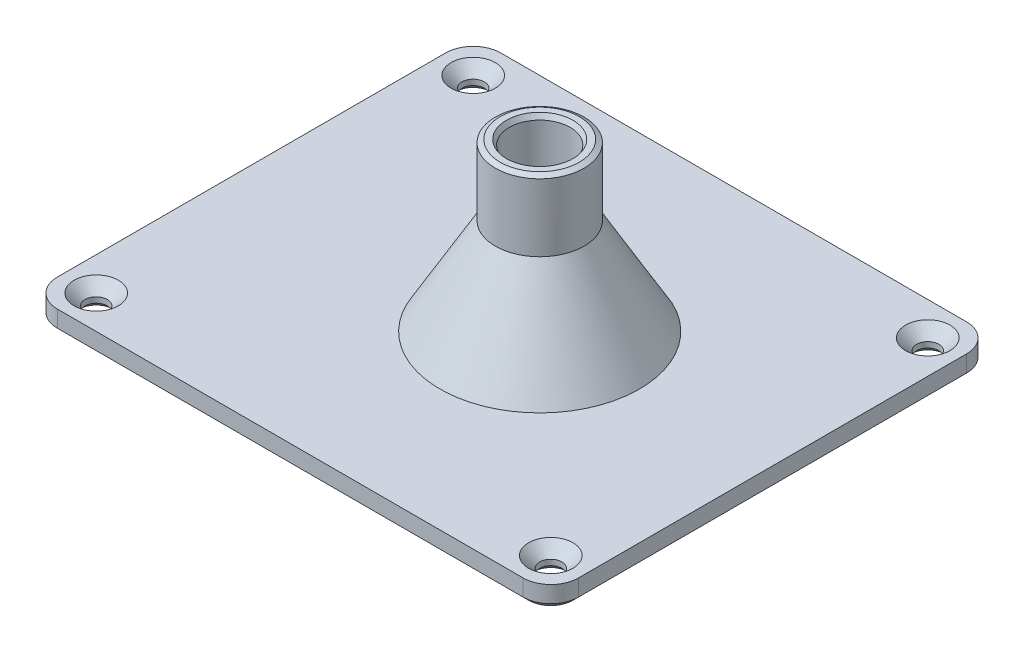
ISO-10303-21;
HEADER;
FILE_DESCRIPTION(('STEP AP214'),'2;1');
FILE_NAME('part.step','',(''),(''),'','','');
FILE_SCHEMA(('AUTOMOTIVE_DESIGN { 1 0 10303 214 1 1 1 1 }'));
ENDSEC;
DATA;
#1=APPLICATION_CONTEXT('core data for automotive mechanical design processes');
#2=APPLICATION_PROTOCOL_DEFINITION('international standard','automotive_design',2000,#1);
#3=PRODUCT_CONTEXT('',#1,'mechanical');
#4=PRODUCT('Part','Part','',(#3));
#5=PRODUCT_RELATED_PRODUCT_CATEGORY('part','',(#4));
#6=PRODUCT_DEFINITION_FORMATION('','',#4);
#7=PRODUCT_DEFINITION_CONTEXT('part definition',#1,'design');
#8=PRODUCT_DEFINITION('design','',#6,#7);
#9=PRODUCT_DEFINITION_SHAPE('','',#8);
#10=(LENGTH_UNIT() NAMED_UNIT(*) SI_UNIT(.MILLI.,.METRE.));
#11=(NAMED_UNIT(*) PLANE_ANGLE_UNIT() SI_UNIT($,.RADIAN.));
#12=(NAMED_UNIT(*) SI_UNIT($,.STERADIAN.) SOLID_ANGLE_UNIT());
#13=UNCERTAINTY_MEASURE_WITH_UNIT(LENGTH_MEASURE(1.E-05),#10,'distance_accuracy_value','');
#14=(GEOMETRIC_REPRESENTATION_CONTEXT(3) GLOBAL_UNCERTAINTY_ASSIGNED_CONTEXT((#13)) GLOBAL_UNIT_ASSIGNED_CONTEXT((#10,
#11,#12)) REPRESENTATION_CONTEXT('',''));
#15=CARTESIAN_POINT('',(0.,0.,0.));
#16=DIRECTION('',(0.,0.,1.));
#17=DIRECTION('',(1.,0.,0.));
#18=AXIS2_PLACEMENT_3D('',#15,#16,#17);
#19=CARTESIAN_POINT('',(0.,4.,0.));
#20=DIRECTION('',(0.,-1.,0.));
#21=DIRECTION('',(0.,0.,-1.));
#22=AXIS2_PLACEMENT_3D('',#19,#20,#21);
#23=PLANE('',#22);
#24=CARTESIAN_POINT('',(-41.,4.,34.));
#25=DIRECTION('',(0.,-1.,0.));
#26=DIRECTION('',(0.,0.,-1.));
#27=AXIS2_PLACEMENT_3D('',#24,#25,#26);
#28=CIRCLE('',#27,4.00000000000003);
#29=CARTESIAN_POINT('',(-41.,4.,30.));
#30=VERTEX_POINT('',#29);
#31=EDGE_CURVE('E329',#30,#30,#28,.T.);
#32=ORIENTED_EDGE('',*,*,#31,.T.);
#33=EDGE_LOOP('',(#32));
#34=FACE_BOUND('',#33,.T.);
#35=CARTESIAN_POINT('',(41.,4.,34.));
#36=DIRECTION('',(0.,-1.,0.));
#37=DIRECTION('',(0.,0.,-1.));
#38=AXIS2_PLACEMENT_3D('',#35,#36,#37);
#39=CIRCLE('',#38,4.00000000000003);
#40=CARTESIAN_POINT('',(41.,4.,30.));
#41=VERTEX_POINT('',#40);
#42=EDGE_CURVE('E325',#41,#41,#39,.T.);
#43=ORIENTED_EDGE('',*,*,#42,.T.);
#44=EDGE_LOOP('',(#43));
#45=FACE_BOUND('',#44,.T.);
#46=CARTESIAN_POINT('',(41.,4.,-34.));
#47=DIRECTION('',(0.,-1.,0.));
#48=DIRECTION('',(0.,0.,-1.));
#49=AXIS2_PLACEMENT_3D('',#46,#47,#48);
#50=CIRCLE('',#49,4.00000000000003);
#51=CARTESIAN_POINT('',(41.,4.,-38.));
#52=VERTEX_POINT('',#51);
#53=EDGE_CURVE('E321',#52,#52,#50,.T.);
#54=ORIENTED_EDGE('',*,*,#53,.T.);
#55=EDGE_LOOP('',(#54));
#56=FACE_BOUND('',#55,.T.);
#57=CARTESIAN_POINT('',(-41.,4.,-34.));
#58=DIRECTION('',(0.,-1.,0.));
#59=DIRECTION('',(0.,0.,-1.));
#60=AXIS2_PLACEMENT_3D('',#57,#58,#59);
#61=CIRCLE('',#60,4.00000000000003);
#62=CARTESIAN_POINT('',(-41.,4.,-38.));
#63=VERTEX_POINT('',#62);
#64=EDGE_CURVE('E317',#63,#63,#61,.T.);
#65=ORIENTED_EDGE('',*,*,#64,.T.);
#66=EDGE_LOOP('',(#65));
#67=FACE_BOUND('',#66,.T.);
#68=CARTESIAN_POINT('',(5.00000000000001,4.,0.));
#69=DIRECTION('',(0.,-1.,0.));
#70=DIRECTION('',(0.,0.,-1.));
#71=AXIS2_PLACEMENT_3D('',#68,#69,#70);
#72=CIRCLE('',#71,18.);
#73=CARTESIAN_POINT('',(5.00000000000001,4.,-18.));
#74=VERTEX_POINT('',#73);
#75=EDGE_CURVE('E309',#74,#74,#72,.T.);
#76=ORIENTED_EDGE('',*,*,#75,.T.);
#77=EDGE_LOOP('',(#76));
#78=FACE_BOUND('',#77,.T.);
#79=DIRECTION('',(0.,0.,1.));
#80=VECTOR('',#79,1.);
#81=CARTESIAN_POINT('',(-47.,4.,40.));
#82=LINE('',#81,#80);
#83=CARTESIAN_POINT('',(-47.,4.,-35.));
#84=VERTEX_POINT('',#83);
#85=CARTESIAN_POINT('',(-47.,4.,35.));
#86=VERTEX_POINT('',#85);
#87=EDGE_CURVE('E140',#84,#86,#82,.T.);
#88=ORIENTED_EDGE('',*,*,#87,.T.);
#89=CARTESIAN_POINT('',(-42.,4.,35.));
#90=DIRECTION('',(0.,-1.,0.));
#91=DIRECTION('',(0.,0.,-1.));
#92=AXIS2_PLACEMENT_3D('',#89,#90,#91);
#93=CIRCLE('',#92,5.);
#94=CARTESIAN_POINT('',(-42.,4.,40.));
#95=VERTEX_POINT('',#94);
#96=EDGE_CURVE('E135',#86,#95,#93,.F.);
#97=ORIENTED_EDGE('',*,*,#96,.T.);
#98=DIRECTION('',(1.,0.,0.));
#99=VECTOR('',#98,1.);
#100=CARTESIAN_POINT('',(-47.,4.,40.));
#101=LINE('',#100,#99);
#102=CARTESIAN_POINT('',(42.,4.,40.));
#103=VERTEX_POINT('',#102);
#104=EDGE_CURVE('E137',#95,#103,#101,.T.);
#105=ORIENTED_EDGE('',*,*,#104,.T.);
#106=CARTESIAN_POINT('',(42.,4.,35.));
#107=DIRECTION('',(0.,-1.,0.));
#108=DIRECTION('',(0.,0.,-1.));
#109=AXIS2_PLACEMENT_3D('',#106,#107,#108);
#110=CIRCLE('',#109,5.);
#111=CARTESIAN_POINT('',(47.,4.,35.));
#112=VERTEX_POINT('',#111);
#113=EDGE_CURVE('E165',#103,#112,#110,.F.);
#114=ORIENTED_EDGE('',*,*,#113,.T.);
#115=DIRECTION('',(0.,0.,-1.));
#116=VECTOR('',#115,1.);
#117=CARTESIAN_POINT('',(47.,4.,40.));
#118=LINE('',#117,#116);
#119=CARTESIAN_POINT('',(47.,4.,-35.));
#120=VERTEX_POINT('',#119);
#121=EDGE_CURVE('E305',#112,#120,#118,.T.);
#122=ORIENTED_EDGE('',*,*,#121,.T.);
#123=CARTESIAN_POINT('',(42.,4.,-35.));
#124=DIRECTION('',(0.,-1.,0.));
#125=DIRECTION('',(0.,0.,-1.));
#126=AXIS2_PLACEMENT_3D('',#123,#124,#125);
#127=CIRCLE('',#126,5.);
#128=CARTESIAN_POINT('',(42.,4.,-40.));
#129=VERTEX_POINT('',#128);
#130=EDGE_CURVE('E168',#120,#129,#127,.F.);
#131=ORIENTED_EDGE('',*,*,#130,.T.);
#132=DIRECTION('',(-1.,0.,0.));
#133=VECTOR('',#132,1.);
#134=CARTESIAN_POINT('',(-47.,4.,-40.));
#135=LINE('',#134,#133);
#136=CARTESIAN_POINT('',(-42.,4.,-40.));
#137=VERTEX_POINT('',#136);
#138=EDGE_CURVE('E592',#129,#137,#135,.T.);
#139=ORIENTED_EDGE('',*,*,#138,.T.);
#140=CARTESIAN_POINT('',(-42.,4.,-35.));
#141=DIRECTION('',(0.,-1.,0.));
#142=DIRECTION('',(0.,0.,-1.));
#143=AXIS2_PLACEMENT_3D('',#140,#141,#142);
#144=CIRCLE('',#143,5.);
#145=EDGE_CURVE('E143',#137,#84,#144,.F.);
#146=ORIENTED_EDGE('',*,*,#145,.T.);
#147=EDGE_LOOP('',(#88,#97,#105,#114,#122,#131,#139,#146));
#148=FACE_BOUND('',#147,.T.);
#149=ADVANCED_FACE('F41',(#34,#45,#56,#67,#78,#148),#23,.F.);
#150=CARTESIAN_POINT('',(0.,0.,0.));
#151=DIRECTION('',(0.,-1.,0.));
#152=DIRECTION('',(0.,0.,-1.));
#153=AXIS2_PLACEMENT_3D('',#150,#151,#152);
#154=PLANE('',#153);
#155=CARTESIAN_POINT('',(41.,0.,34.));
#156=DIRECTION('',(0.,-1.,0.));
#157=DIRECTION('',(0.,0.,-1.));
#158=AXIS2_PLACEMENT_3D('',#155,#156,#157);
#159=CIRCLE('',#158,3.00000000000002);
#160=CARTESIAN_POINT('',(41.,0.,31.));
#161=VERTEX_POINT('',#160);
#162=EDGE_CURVE('E227',#161,#161,#159,.F.);
#163=ORIENTED_EDGE('',*,*,#162,.T.);
#164=EDGE_LOOP('',(#163));
#165=FACE_BOUND('',#164,.T.);
#166=CARTESIAN_POINT('',(-41.,0.,-34.));
#167=DIRECTION('',(0.,-1.,0.));
#168=DIRECTION('',(0.,0.,-1.));
#169=AXIS2_PLACEMENT_3D('',#166,#167,#168);
#170=CIRCLE('',#169,3.00000000000002);
#171=CARTESIAN_POINT('',(-41.,0.,-37.));
#172=VERTEX_POINT('',#171);
#173=EDGE_CURVE('E223',#172,#172,#170,.F.);
#174=ORIENTED_EDGE('',*,*,#173,.T.);
#175=EDGE_LOOP('',(#174));
#176=FACE_BOUND('',#175,.T.);
#177=DIRECTION('',(0.,0.,1.));
#178=VECTOR('',#177,1.);
#179=CARTESIAN_POINT('',(46.,0.,35.));
#180=LINE('',#179,#178);
#181=CARTESIAN_POINT('',(46.,0.,-35.));
#182=VERTEX_POINT('',#181);
#183=CARTESIAN_POINT('',(46.,0.,35.));
#184=VERTEX_POINT('',#183);
#185=EDGE_CURVE('E216',#182,#184,#180,.T.);
#186=ORIENTED_EDGE('',*,*,#185,.T.);
#187=CARTESIAN_POINT('',(42.,0.,35.));
#188=DIRECTION('',(0.,-1.,0.));
#189=DIRECTION('',(0.,0.,-1.));
#190=AXIS2_PLACEMENT_3D('',#187,#188,#189);
#191=CIRCLE('',#190,4.);
#192=CARTESIAN_POINT('',(42.,0.,39.));
#193=VERTEX_POINT('',#192);
#194=EDGE_CURVE('E219',#184,#193,#191,.T.);
#195=ORIENTED_EDGE('',*,*,#194,.T.);
#196=DIRECTION('',(-1.,0.,0.));
#197=VECTOR('',#196,1.);
#198=CARTESIAN_POINT('',(-42.,0.,39.));
#199=LINE('',#198,#197);
#200=CARTESIAN_POINT('',(-42.,0.,39.));
#201=VERTEX_POINT('',#200);
#202=EDGE_CURVE('E198',#193,#201,#199,.T.);
#203=ORIENTED_EDGE('',*,*,#202,.T.);
#204=CARTESIAN_POINT('',(-42.,0.,35.));
#205=DIRECTION('',(0.,-1.,0.));
#206=DIRECTION('',(0.,0.,-1.));
#207=AXIS2_PLACEMENT_3D('',#204,#205,#206);
#208=CIRCLE('',#207,4.);
#209=CARTESIAN_POINT('',(-46.,0.,35.));
#210=VERTEX_POINT('',#209);
#211=EDGE_CURVE('E201',#201,#210,#208,.T.);
#212=ORIENTED_EDGE('',*,*,#211,.T.);
#213=DIRECTION('',(0.,0.,-1.));
#214=VECTOR('',#213,1.);
#215=CARTESIAN_POINT('',(-46.,0.,-35.));
#216=LINE('',#215,#214);
#217=CARTESIAN_POINT('',(-46.,0.,-35.));
#218=VERTEX_POINT('',#217);
#219=EDGE_CURVE('E204',#210,#218,#216,.T.);
#220=ORIENTED_EDGE('',*,*,#219,.T.);
#221=CARTESIAN_POINT('',(-42.,0.,-35.));
#222=DIRECTION('',(0.,-1.,0.));
#223=DIRECTION('',(0.,0.,-1.));
#224=AXIS2_PLACEMENT_3D('',#221,#222,#223);
#225=CIRCLE('',#224,4.);
#226=CARTESIAN_POINT('',(-42.,0.,-39.));
#227=VERTEX_POINT('',#226);
#228=EDGE_CURVE('E207',#218,#227,#225,.T.);
#229=ORIENTED_EDGE('',*,*,#228,.T.);
#230=DIRECTION('',(1.,0.,0.));
#231=VECTOR('',#230,1.);
#232=CARTESIAN_POINT('',(42.,0.,-39.));
#233=LINE('',#232,#231);
#234=CARTESIAN_POINT('',(42.,0.,-39.));
#235=VERTEX_POINT('',#234);
#236=EDGE_CURVE('E210',#227,#235,#233,.T.);
#237=ORIENTED_EDGE('',*,*,#236,.T.);
#238=CARTESIAN_POINT('',(42.,0.,-35.));
#239=DIRECTION('',(0.,-1.,0.));
#240=DIRECTION('',(0.,0.,-1.));
#241=AXIS2_PLACEMENT_3D('',#238,#239,#240);
#242=CIRCLE('',#241,4.);
#243=EDGE_CURVE('E213',#235,#182,#242,.T.);
#244=ORIENTED_EDGE('',*,*,#243,.T.);
#245=EDGE_LOOP('',(#186,#195,#203,#212,#220,#229,#237,#244));
#246=FACE_BOUND('',#245,.T.);
#247=CARTESIAN_POINT('',(41.,0.,-34.));
#248=DIRECTION('',(0.,-1.,0.));
#249=DIRECTION('',(0.,0.,-1.));
#250=AXIS2_PLACEMENT_3D('',#247,#248,#249);
#251=CIRCLE('',#250,3.00000000000002);
#252=CARTESIAN_POINT('',(41.,0.,-37.));
#253=VERTEX_POINT('',#252);
#254=EDGE_CURVE('E194',#253,#253,#251,.F.);
#255=ORIENTED_EDGE('',*,*,#254,.T.);
#256=EDGE_LOOP('',(#255));
#257=FACE_BOUND('',#256,.T.);
#258=CARTESIAN_POINT('',(-41.,0.,34.));
#259=DIRECTION('',(0.,-1.,0.));
#260=DIRECTION('',(0.,0.,-1.));
#261=AXIS2_PLACEMENT_3D('',#258,#259,#260);
#262=CIRCLE('',#261,3.00000000000002);
#263=CARTESIAN_POINT('',(-41.,0.,31.));
#264=VERTEX_POINT('',#263);
#265=EDGE_CURVE('E190',#264,#264,#262,.F.);
#266=ORIENTED_EDGE('',*,*,#265,.T.);
#267=EDGE_LOOP('',(#266));
#268=FACE_BOUND('',#267,.T.);
#269=CARTESIAN_POINT('',(5.00000000000001,0.,0.));
#270=DIRECTION('',(0.,-1.,0.));
#271=DIRECTION('',(0.,0.,-1.));
#272=AXIS2_PLACEMENT_3D('',#269,#270,#271);
#273=CIRCLE('',#272,6.49999999999999);
#274=CARTESIAN_POINT('',(5.00000000000001,0.,-6.49999999999999));
#275=VERTEX_POINT('',#274);
#276=EDGE_CURVE('E186',#275,#275,#273,.F.);
#277=ORIENTED_EDGE('',*,*,#276,.T.);
#278=EDGE_LOOP('',(#277));
#279=FACE_BOUND('',#278,.T.);
#280=ADVANCED_FACE('F380',(#165,#176,#246,#257,#268,#279),#154,.T.);
#281=CARTESIAN_POINT('',(47.,4.,40.));
#282=DIRECTION('',(-1.,0.,0.));
#283=DIRECTION('',(0.,0.,1.));
#284=AXIS2_PLACEMENT_3D('',#281,#282,#283);
#285=PLANE('',#284);
#286=DIRECTION('',(0.,-1.,0.));
#287=VECTOR('',#286,1.);
#288=CARTESIAN_POINT('',(47.,4.,35.));
#289=LINE('',#288,#287);
#290=CARTESIAN_POINT('',(47.,1.,35.));
#291=VERTEX_POINT('',#290);
#292=EDGE_CURVE('E179',#112,#291,#289,.T.);
#293=ORIENTED_EDGE('',*,*,#292,.T.);
#294=DIRECTION('',(0.,0.,-1.));
#295=VECTOR('',#294,1.);
#296=CARTESIAN_POINT('',(47.,1.,-35.));
#297=LINE('',#296,#295);
#298=CARTESIAN_POINT('',(47.,1.,-35.));
#299=VERTEX_POINT('',#298);
#300=EDGE_CURVE('E243',#291,#299,#297,.T.);
#301=ORIENTED_EDGE('',*,*,#300,.T.);
#302=DIRECTION('',(0.,-1.,0.));
#303=VECTOR('',#302,1.);
#304=CARTESIAN_POINT('',(47.,4.,-35.));
#305=LINE('',#304,#303);
#306=EDGE_CURVE('E183',#299,#120,#305,.F.);
#307=ORIENTED_EDGE('',*,*,#306,.T.);
#308=ORIENTED_EDGE('',*,*,#121,.F.);
#309=EDGE_LOOP('',(#293,#301,#307,#308));
#310=FACE_BOUND('',#309,.T.);
#311=ADVANCED_FACE('F382',(#310),#285,.F.);
#312=CARTESIAN_POINT('',(-47.,4.,-40.));
#313=DIRECTION('',(0.,0.,1.));
#314=DIRECTION('',(1.,0.,0.));
#315=AXIS2_PLACEMENT_3D('',#312,#313,#314);
#316=PLANE('',#315);
#317=DIRECTION('',(0.,-1.,0.));
#318=VECTOR('',#317,1.);
#319=CARTESIAN_POINT('',(42.,4.,-40.));
#320=LINE('',#319,#318);
#321=CARTESIAN_POINT('',(42.,1.,-40.));
#322=VERTEX_POINT('',#321);
#323=EDGE_CURVE('E142',#129,#322,#320,.T.);
#324=ORIENTED_EDGE('',*,*,#323,.T.);
#325=DIRECTION('',(-1.,0.,0.));
#326=VECTOR('',#325,1.);
#327=CARTESIAN_POINT('',(-42.,1.,-40.));
#328=LINE('',#327,#326);
#329=CARTESIAN_POINT('',(-42.,1.,-40.));
#330=VERTEX_POINT('',#329);
#331=EDGE_CURVE('E249',#322,#330,#328,.T.);
#332=ORIENTED_EDGE('',*,*,#331,.T.);
#333=DIRECTION('',(0.,-1.,0.));
#334=VECTOR('',#333,1.);
#335=CARTESIAN_POINT('',(-42.,4.,-40.));
#336=LINE('',#335,#334);
#337=EDGE_CURVE('E176',#330,#137,#336,.F.);
#338=ORIENTED_EDGE('',*,*,#337,.T.);
#339=ORIENTED_EDGE('',*,*,#138,.F.);
#340=EDGE_LOOP('',(#324,#332,#338,#339));
#341=FACE_BOUND('',#340,.T.);
#342=ADVANCED_FACE('F389',(#341),#316,.F.);
#343=CARTESIAN_POINT('',(-47.,4.,40.));
#344=DIRECTION('',(1.,0.,0.));
#345=DIRECTION('',(0.,0.,-1.));
#346=AXIS2_PLACEMENT_3D('',#343,#344,#345);
#347=PLANE('',#346);
#348=DIRECTION('',(0.,-1.,0.));
#349=VECTOR('',#348,1.);
#350=CARTESIAN_POINT('',(-47.,4.,-35.));
#351=LINE('',#350,#349);
#352=CARTESIAN_POINT('',(-47.,1.,-35.));
#353=VERTEX_POINT('',#352);
#354=EDGE_CURVE('E155',#84,#353,#351,.T.);
#355=ORIENTED_EDGE('',*,*,#354,.T.);
#356=DIRECTION('',(0.,0.,1.));
#357=VECTOR('',#356,1.);
#358=CARTESIAN_POINT('',(-47.,1.,35.));
#359=LINE('',#358,#357);
#360=CARTESIAN_POINT('',(-47.,1.,35.));
#361=VERTEX_POINT('',#360);
#362=EDGE_CURVE('E66',#353,#361,#359,.T.);
#363=ORIENTED_EDGE('',*,*,#362,.T.);
#364=DIRECTION('',(0.,-1.,0.));
#365=VECTOR('',#364,1.);
#366=CARTESIAN_POINT('',(-47.,4.,35.));
#367=LINE('',#366,#365);
#368=EDGE_CURVE('E159',#361,#86,#367,.F.);
#369=ORIENTED_EDGE('',*,*,#368,.T.);
#370=ORIENTED_EDGE('',*,*,#87,.F.);
#371=EDGE_LOOP('',(#355,#363,#369,#370));
#372=FACE_BOUND('',#371,.T.);
#373=ADVANCED_FACE('F400',(#372),#347,.F.);
#374=CARTESIAN_POINT('',(-47.,4.,40.));
#375=DIRECTION('',(0.,0.,-1.));
#376=DIRECTION('',(-1.,0.,0.));
#377=AXIS2_PLACEMENT_3D('',#374,#375,#376);
#378=PLANE('',#377);
#379=DIRECTION('',(0.,-1.,0.));
#380=VECTOR('',#379,1.);
#381=CARTESIAN_POINT('',(-42.,4.,40.));
#382=LINE('',#381,#380);
#383=CARTESIAN_POINT('',(-42.,1.,40.));
#384=VERTEX_POINT('',#383);
#385=EDGE_CURVE('E147',#95,#384,#382,.T.);
#386=ORIENTED_EDGE('',*,*,#385,.T.);
#387=DIRECTION('',(1.,0.,0.));
#388=VECTOR('',#387,1.);
#389=CARTESIAN_POINT('',(42.,1.,40.));
#390=LINE('',#389,#388);
#391=CARTESIAN_POINT('',(42.,1.,40.));
#392=VERTEX_POINT('',#391);
#393=EDGE_CURVE('E259',#384,#392,#390,.T.);
#394=ORIENTED_EDGE('',*,*,#393,.T.);
#395=DIRECTION('',(0.,-1.,0.));
#396=VECTOR('',#395,1.);
#397=CARTESIAN_POINT('',(42.,4.,40.));
#398=LINE('',#397,#396);
#399=EDGE_CURVE('E150',#392,#103,#398,.F.);
#400=ORIENTED_EDGE('',*,*,#399,.T.);
#401=ORIENTED_EDGE('',*,*,#104,.F.);
#402=EDGE_LOOP('',(#386,#394,#400,#401));
#403=FACE_BOUND('',#402,.T.);
#404=ADVANCED_FACE('F146',(#403),#378,.F.);
#405=CARTESIAN_POINT('',(41.,4.,-34.));
#406=DIRECTION('',(0.,-1.,0.));
#407=DIRECTION('',(0.,0.,-1.));
#408=AXIS2_PLACEMENT_3D('',#405,#406,#407);
#409=CYLINDRICAL_SURFACE('',#408,2.);
#410=CARTESIAN_POINT('',(41.,1.99999999999998,-34.));
#411=DIRECTION('',(0.,-1.,0.));
#412=DIRECTION('',(0.,0.,-1.));
#413=AXIS2_PLACEMENT_3D('',#410,#411,#412);
#414=CIRCLE('',#413,2.);
#415=CARTESIAN_POINT('',(41.,1.99999999999998,-36.));
#416=VERTEX_POINT('',#415);
#417=EDGE_CURVE('E337',#416,#416,#414,.F.);
#418=ORIENTED_EDGE('',*,*,#417,.T.);
#419=EDGE_LOOP('',(#418));
#420=FACE_BOUND('',#419,.T.);
#421=CARTESIAN_POINT('',(41.,1.00000000000002,-34.));
#422=DIRECTION('',(0.,-1.,0.));
#423=DIRECTION('',(0.,0.,-1.));
#424=AXIS2_PLACEMENT_3D('',#421,#422,#423);
#425=CIRCLE('',#424,2.);
#426=CARTESIAN_POINT('',(41.,1.00000000000002,-36.));
#427=VERTEX_POINT('',#426);
#428=EDGE_CURVE('E262',#427,#427,#425,.T.);
#429=ORIENTED_EDGE('',*,*,#428,.T.);
#430=EDGE_LOOP('',(#429));
#431=FACE_BOUND('',#430,.T.);
#432=ADVANCED_FACE('F399',(#420,#431),#409,.F.);
#433=CARTESIAN_POINT('',(-41.,4.,-34.));
#434=DIRECTION('',(0.,-1.,0.));
#435=DIRECTION('',(0.,0.,-1.));
#436=AXIS2_PLACEMENT_3D('',#433,#434,#435);
#437=CYLINDRICAL_SURFACE('',#436,2.);
#438=CARTESIAN_POINT('',(-41.,1.99999999999998,-34.));
#439=DIRECTION('',(0.,-1.,0.));
#440=DIRECTION('',(0.,0.,-1.));
#441=AXIS2_PLACEMENT_3D('',#438,#439,#440);
#442=CIRCLE('',#441,2.);
#443=CARTESIAN_POINT('',(-41.,1.99999999999998,-36.));
#444=VERTEX_POINT('',#443);
#445=EDGE_CURVE('E341',#444,#444,#442,.F.);
#446=ORIENTED_EDGE('',*,*,#445,.T.);
#447=EDGE_LOOP('',(#446));
#448=FACE_BOUND('',#447,.T.);
#449=CARTESIAN_POINT('',(-41.,1.00000000000002,-34.));
#450=DIRECTION('',(0.,-1.,0.));
#451=DIRECTION('',(0.,0.,-1.));
#452=AXIS2_PLACEMENT_3D('',#449,#450,#451);
#453=CIRCLE('',#452,2.);
#454=CARTESIAN_POINT('',(-41.,1.00000000000002,-36.));
#455=VERTEX_POINT('',#454);
#456=EDGE_CURVE('E235',#455,#455,#453,.T.);
#457=ORIENTED_EDGE('',*,*,#456,.T.);
#458=EDGE_LOOP('',(#457));
#459=FACE_BOUND('',#458,.T.);
#460=ADVANCED_FACE('F550',(#448,#459),#437,.F.);
#461=CARTESIAN_POINT('',(-41.,4.,34.));
#462=DIRECTION('',(0.,-1.,0.));
#463=DIRECTION('',(0.,0.,-1.));
#464=AXIS2_PLACEMENT_3D('',#461,#462,#463);
#465=CYLINDRICAL_SURFACE('',#464,2.);
#466=CARTESIAN_POINT('',(-41.,1.99999999999998,34.));
#467=DIRECTION('',(0.,-1.,0.));
#468=DIRECTION('',(0.,0.,-1.));
#469=AXIS2_PLACEMENT_3D('',#466,#467,#468);
#470=CIRCLE('',#469,2.);
#471=CARTESIAN_POINT('',(-41.,1.99999999999998,32.));
#472=VERTEX_POINT('',#471);
#473=EDGE_CURVE('E313',#472,#472,#470,.F.);
#474=ORIENTED_EDGE('',*,*,#473,.T.);
#475=EDGE_LOOP('',(#474));
#476=FACE_BOUND('',#475,.T.);
#477=CARTESIAN_POINT('',(-41.,1.00000000000002,34.));
#478=DIRECTION('',(0.,-1.,0.));
#479=DIRECTION('',(0.,0.,-1.));
#480=AXIS2_PLACEMENT_3D('',#477,#478,#479);
#481=CIRCLE('',#480,2.);
#482=CARTESIAN_POINT('',(-41.,1.00000000000002,32.));
#483=VERTEX_POINT('',#482);
#484=EDGE_CURVE('E266',#483,#483,#481,.T.);
#485=ORIENTED_EDGE('',*,*,#484,.T.);
#486=EDGE_LOOP('',(#485));
#487=FACE_BOUND('',#486,.T.);
#488=ADVANCED_FACE('F553',(#476,#487),#465,.F.);
#489=CARTESIAN_POINT('',(41.,4.,34.));
#490=DIRECTION('',(0.,-1.,0.));
#491=DIRECTION('',(0.,0.,-1.));
#492=AXIS2_PLACEMENT_3D('',#489,#490,#491);
#493=CYLINDRICAL_SURFACE('',#492,2.);
#494=CARTESIAN_POINT('',(41.,1.99999999999998,34.));
#495=DIRECTION('',(0.,-1.,0.));
#496=DIRECTION('',(0.,0.,-1.));
#497=AXIS2_PLACEMENT_3D('',#494,#495,#496);
#498=CIRCLE('',#497,2.);
#499=CARTESIAN_POINT('',(41.,1.99999999999998,32.));
#500=VERTEX_POINT('',#499);
#501=EDGE_CURVE('E333',#500,#500,#498,.F.);
#502=ORIENTED_EDGE('',*,*,#501,.T.);
#503=EDGE_LOOP('',(#502));
#504=FACE_BOUND('',#503,.T.);
#505=CARTESIAN_POINT('',(41.,1.00000000000002,34.));
#506=DIRECTION('',(0.,-1.,0.));
#507=DIRECTION('',(0.,0.,-1.));
#508=AXIS2_PLACEMENT_3D('',#505,#506,#507);
#509=CIRCLE('',#508,2.);
#510=CARTESIAN_POINT('',(41.,1.00000000000002,32.));
#511=VERTEX_POINT('',#510);
#512=EDGE_CURVE('E231',#511,#511,#509,.T.);
#513=ORIENTED_EDGE('',*,*,#512,.T.);
#514=EDGE_LOOP('',(#513));
#515=FACE_BOUND('',#514,.T.);
#516=ADVANCED_FACE('F409',(#504,#515),#493,.F.);
#517=CARTESIAN_POINT('',(-42.,4.,35.));
#518=DIRECTION('',(0.,-1.,0.));
#519=DIRECTION('',(0.,0.,-1.));
#520=AXIS2_PLACEMENT_3D('',#517,#518,#519);
#521=CYLINDRICAL_SURFACE('',#520,5.);
#522=ORIENTED_EDGE('',*,*,#368,.F.);
#523=CARTESIAN_POINT('',(-42.,1.,35.));
#524=DIRECTION('',(0.,-1.,0.));
#525=DIRECTION('',(0.,0.,-1.));
#526=AXIS2_PLACEMENT_3D('',#523,#524,#525);
#527=CIRCLE('',#526,5.);
#528=EDGE_CURVE('E58',#361,#384,#527,.F.);
#529=ORIENTED_EDGE('',*,*,#528,.T.);
#530=ORIENTED_EDGE('',*,*,#385,.F.);
#531=ORIENTED_EDGE('',*,*,#96,.F.);
#532=EDGE_LOOP('',(#522,#529,#530,#531));
#533=FACE_BOUND('',#532,.T.);
#534=ADVANCED_FACE('F153',(#533),#521,.T.);
#535=CARTESIAN_POINT('',(-42.,4.,-35.));
#536=DIRECTION('',(0.,-1.,0.));
#537=DIRECTION('',(0.,0.,-1.));
#538=AXIS2_PLACEMENT_3D('',#535,#536,#537);
#539=CYLINDRICAL_SURFACE('',#538,5.);
#540=ORIENTED_EDGE('',*,*,#337,.F.);
#541=CARTESIAN_POINT('',(-42.,1.,-35.));
#542=DIRECTION('',(0.,-1.,0.));
#543=DIRECTION('',(0.,0.,-1.));
#544=AXIS2_PLACEMENT_3D('',#541,#542,#543);
#545=CIRCLE('',#544,5.);
#546=EDGE_CURVE('E252',#330,#353,#545,.F.);
#547=ORIENTED_EDGE('',*,*,#546,.T.);
#548=ORIENTED_EDGE('',*,*,#354,.F.);
#549=ORIENTED_EDGE('',*,*,#145,.F.);
#550=EDGE_LOOP('',(#540,#547,#548,#549));
#551=FACE_BOUND('',#550,.T.);
#552=ADVANCED_FACE('F408',(#551),#539,.T.);
#553=CARTESIAN_POINT('',(42.,4.,-35.));
#554=DIRECTION('',(0.,-1.,0.));
#555=DIRECTION('',(0.,0.,-1.));
#556=AXIS2_PLACEMENT_3D('',#553,#554,#555);
#557=CYLINDRICAL_SURFACE('',#556,5.);
#558=ORIENTED_EDGE('',*,*,#306,.F.);
#559=CARTESIAN_POINT('',(42.,1.,-35.));
#560=DIRECTION('',(0.,-1.,0.));
#561=DIRECTION('',(0.,0.,-1.));
#562=AXIS2_PLACEMENT_3D('',#559,#560,#561);
#563=CIRCLE('',#562,5.);
#564=EDGE_CURVE('E246',#299,#322,#563,.F.);
#565=ORIENTED_EDGE('',*,*,#564,.T.);
#566=ORIENTED_EDGE('',*,*,#323,.F.);
#567=ORIENTED_EDGE('',*,*,#130,.F.);
#568=EDGE_LOOP('',(#558,#565,#566,#567));
#569=FACE_BOUND('',#568,.T.);
#570=ADVANCED_FACE('F412',(#569),#557,.T.);
#571=CARTESIAN_POINT('',(42.,4.,35.));
#572=DIRECTION('',(0.,-1.,0.));
#573=DIRECTION('',(0.,0.,-1.));
#574=AXIS2_PLACEMENT_3D('',#571,#572,#573);
#575=CYLINDRICAL_SURFACE('',#574,5.);
#576=ORIENTED_EDGE('',*,*,#399,.F.);
#577=CARTESIAN_POINT('',(42.,1.,35.));
#578=DIRECTION('',(0.,-1.,0.));
#579=DIRECTION('',(0.,0.,-1.));
#580=AXIS2_PLACEMENT_3D('',#577,#578,#579);
#581=CIRCLE('',#580,5.);
#582=EDGE_CURVE('E239',#392,#291,#581,.F.);
#583=ORIENTED_EDGE('',*,*,#582,.T.);
#584=ORIENTED_EDGE('',*,*,#292,.F.);
#585=ORIENTED_EDGE('',*,*,#113,.F.);
#586=EDGE_LOOP('',(#576,#583,#584,#585));
#587=FACE_BOUND('',#586,.T.);
#588=ADVANCED_FACE('F416',(#587),#575,.T.);
#589=CARTESIAN_POINT('',(5.00000000000001,34.,0.));
#590=DIRECTION('',(0.,-1.,0.));
#591=DIRECTION('',(0.,0.,-1.));
#592=AXIS2_PLACEMENT_3D('',#589,#590,#591);
#593=CYLINDRICAL_SURFACE('',#592,8.);
#594=CARTESIAN_POINT('',(5.00000000000001,33.5,0.));
#595=DIRECTION('',(0.,1.,0.));
#596=DIRECTION('',(0.,0.,1.));
#597=AXIS2_PLACEMENT_3D('',#594,#595,#596);
#598=CIRCLE('',#597,8.);
#599=CARTESIAN_POINT('',(5.00000000000001,33.5,8.));
#600=VERTEX_POINT('',#599);
#601=EDGE_CURVE('E11',#600,#600,#598,.F.);
#602=ORIENTED_EDGE('',*,*,#601,.T.);
#603=EDGE_LOOP('',(#602));
#604=FACE_BOUND('',#603,.T.);
#605=CARTESIAN_POINT('',(5.00000000000001,21.3205080756889,0.));
#606=DIRECTION('',(0.,-1.,0.));
#607=DIRECTION('',(0.,0.,-1.));
#608=AXIS2_PLACEMENT_3D('',#605,#606,#607);
#609=CIRCLE('',#608,8.);
#610=CARTESIAN_POINT('',(5.00000000000001,21.3205080756889,-8.));
#611=VERTEX_POINT('',#610);
#612=EDGE_CURVE('E274',#611,#611,#609,.F.);
#613=ORIENTED_EDGE('',*,*,#612,.T.);
#614=EDGE_LOOP('',(#613));
#615=FACE_BOUND('',#614,.T.);
#616=ADVANCED_FACE('F420',(#604,#615),#593,.T.);
#617=CARTESIAN_POINT('',(5.00000000000001,34.,0.));
#618=DIRECTION('',(0.,1.,0.));
#619=DIRECTION('',(0.,0.,1.));
#620=AXIS2_PLACEMENT_3D('',#617,#618,#619);
#621=PLANE('',#620);
#622=CARTESIAN_POINT('',(5.00000000000001,34.,0.));
#623=DIRECTION('',(0.,1.,0.));
#624=DIRECTION('',(0.,0.,1.));
#625=AXIS2_PLACEMENT_3D('',#622,#623,#624);
#626=CIRCLE('',#625,6.00000000000001);
#627=CARTESIAN_POINT('',(5.00000000000001,34.,6.));
#628=VERTEX_POINT('',#627);
#629=EDGE_CURVE('E51',#628,#628,#626,.F.);
#630=ORIENTED_EDGE('',*,*,#629,.T.);
#631=EDGE_LOOP('',(#630));
#632=FACE_BOUND('',#631,.T.);
#633=CARTESIAN_POINT('',(5.00000000000001,34.,0.));
#634=DIRECTION('',(0.,1.,0.));
#635=DIRECTION('',(0.,0.,1.));
#636=AXIS2_PLACEMENT_3D('',#633,#634,#635);
#637=CIRCLE('',#636,7.13397459621559);
#638=CARTESIAN_POINT('',(5.00000000000001,34.,7.13397459621559));
#639=VERTEX_POINT('',#638);
#640=EDGE_CURVE('E349',#639,#639,#637,.T.);
#641=ORIENTED_EDGE('',*,*,#640,.T.);
#642=EDGE_LOOP('',(#641));
#643=FACE_BOUND('',#642,.T.);
#644=ADVANCED_FACE('F356',(#632,#643),#621,.T.);
#645=CARTESIAN_POINT('',(5.00000000000001,0.,0.));
#646=DIRECTION('',(0.,1.,0.));
#647=DIRECTION('',(0.,0.,1.));
#648=AXIS2_PLACEMENT_3D('',#645,#646,#647);
#649=CYLINDRICAL_SURFACE('',#648,5.5);
#650=CARTESIAN_POINT('',(5.00000000000001,33.1339745962155,0.));
#651=DIRECTION('',(0.,1.,0.));
#652=DIRECTION('',(0.,0.,1.));
#653=AXIS2_PLACEMENT_3D('',#650,#651,#652);
#654=CIRCLE('',#653,5.5);
#655=CARTESIAN_POINT('',(5.00000000000001,33.1339745962155,5.5));
#656=VERTEX_POINT('',#655);
#657=EDGE_CURVE('E345',#656,#656,#654,.T.);
#658=ORIENTED_EDGE('',*,*,#657,.T.);
#659=EDGE_LOOP('',(#658));
#660=FACE_BOUND('',#659,.T.);
#661=CARTESIAN_POINT('',(5.00000000000001,1.,0.));
#662=DIRECTION('',(0.,-1.,0.));
#663=DIRECTION('',(0.,0.,-1.));
#664=AXIS2_PLACEMENT_3D('',#661,#662,#663);
#665=CIRCLE('',#664,5.5);
#666=CARTESIAN_POINT('',(5.00000000000001,1.,-5.5));
#667=VERTEX_POINT('',#666);
#668=EDGE_CURVE('E270',#667,#667,#665,.T.);
#669=ORIENTED_EDGE('',*,*,#668,.T.);
#670=EDGE_LOOP('',(#669));
#671=FACE_BOUND('',#670,.T.);
#672=ADVANCED_FACE('F365',(#660,#671),#649,.F.);
#673=CARTESIAN_POINT('',(41.,0.,34.));
#674=DIRECTION('',(0.,-1.,0.));
#675=DIRECTION('',(0.,0.,-1.));
#676=AXIS2_PLACEMENT_3D('',#673,#674,#675);
#677=CONICAL_SURFACE('',#676,3.00000000000002,0.785398163397445);
#678=ORIENTED_EDGE('',*,*,#512,.F.);
#679=EDGE_LOOP('',(#678));
#680=FACE_BOUND('',#679,.T.);
#681=ORIENTED_EDGE('',*,*,#162,.F.);
#682=EDGE_LOOP('',(#681));
#683=FACE_BOUND('',#682,.T.);
#684=ADVANCED_FACE('F368',(#680,#683),#677,.F.);
#685=CARTESIAN_POINT('',(-41.,0.,-34.));
#686=DIRECTION('',(0.,-1.,0.));
#687=DIRECTION('',(0.,0.,-1.));
#688=AXIS2_PLACEMENT_3D('',#685,#686,#687);
#689=CONICAL_SURFACE('',#688,3.00000000000002,0.785398163397445);
#690=ORIENTED_EDGE('',*,*,#456,.F.);
#691=EDGE_LOOP('',(#690));
#692=FACE_BOUND('',#691,.T.);
#693=ORIENTED_EDGE('',*,*,#173,.F.);
#694=EDGE_LOOP('',(#693));
#695=FACE_BOUND('',#694,.T.);
#696=ADVANCED_FACE('F428',(#692,#695),#689,.F.);
#697=CARTESIAN_POINT('',(-42.,0.,-35.));
#698=DIRECTION('',(0.,1.,0.));
#699=DIRECTION('',(0.,0.,1.));
#700=AXIS2_PLACEMENT_3D('',#697,#698,#699);
#701=CONICAL_SURFACE('',#700,4.,0.78539816339745);
#702=DIRECTION('',(0.707106781186547,-0.707106781186547,0.));
#703=VECTOR('',#702,1.);
#704=CARTESIAN_POINT('',(-47.,1.,-35.));
#705=LINE('',#704,#703);
#706=EDGE_CURVE('E297',#353,#218,#705,.T.);
#707=ORIENTED_EDGE('',*,*,#706,.F.);
#708=ORIENTED_EDGE('',*,*,#546,.F.);
#709=DIRECTION('',(0.,0.707106781186547,-0.707106781186547));
#710=VECTOR('',#709,1.);
#711=CARTESIAN_POINT('',(-42.,0.,-39.));
#712=LINE('',#711,#710);
#713=EDGE_CURVE('E301',#227,#330,#712,.T.);
#714=ORIENTED_EDGE('',*,*,#713,.F.);
#715=ORIENTED_EDGE('',*,*,#228,.F.);
#716=EDGE_LOOP('',(#707,#708,#714,#715));
#717=FACE_BOUND('',#716,.T.);
#718=ADVANCED_FACE('F435',(#717),#701,.T.);
#719=CARTESIAN_POINT('',(-47.,1.,-40.));
#720=DIRECTION('',(0.,-0.707106781186547,-0.707106781186547));
#721=DIRECTION('',(1.,0.,0.));
#722=AXIS2_PLACEMENT_3D('',#719,#720,#721);
#723=PLANE('',#722);
#724=ORIENTED_EDGE('',*,*,#713,.T.);
#725=ORIENTED_EDGE('',*,*,#331,.F.);
#726=DIRECTION('',(0.,0.707106781186547,-0.707106781186547));
#727=VECTOR('',#726,1.);
#728=CARTESIAN_POINT('',(42.,0.,-39.));
#729=LINE('',#728,#727);
#730=EDGE_CURVE('E293',#235,#322,#729,.T.);
#731=ORIENTED_EDGE('',*,*,#730,.F.);
#732=ORIENTED_EDGE('',*,*,#236,.F.);
#733=EDGE_LOOP('',(#724,#725,#731,#732));
#734=FACE_BOUND('',#733,.T.);
#735=ADVANCED_FACE('F481',(#734),#723,.T.);
#736=CARTESIAN_POINT('',(-47.,1.,40.));
#737=DIRECTION('',(-0.707106781186547,-0.707106781186547,0.));
#738=DIRECTION('',(0.,0.,-1.));
#739=AXIS2_PLACEMENT_3D('',#736,#737,#738);
#740=PLANE('',#739);
#741=ORIENTED_EDGE('',*,*,#706,.T.);
#742=ORIENTED_EDGE('',*,*,#219,.F.);
#743=DIRECTION('',(0.707106781186547,-0.707106781186547,0.));
#744=VECTOR('',#743,1.);
#745=CARTESIAN_POINT('',(-47.,1.,35.));
#746=LINE('',#745,#744);
#747=EDGE_CURVE('E289',#361,#210,#746,.T.);
#748=ORIENTED_EDGE('',*,*,#747,.F.);
#749=ORIENTED_EDGE('',*,*,#362,.F.);
#750=EDGE_LOOP('',(#741,#742,#748,#749));
#751=FACE_BOUND('',#750,.T.);
#752=ADVANCED_FACE('F474',(#751),#740,.T.);
#753=CARTESIAN_POINT('',(42.,0.,-35.));
#754=DIRECTION('',(0.,1.,0.));
#755=DIRECTION('',(0.,0.,1.));
#756=AXIS2_PLACEMENT_3D('',#753,#754,#755);
#757=CONICAL_SURFACE('',#756,4.,0.78539816339745);
#758=ORIENTED_EDGE('',*,*,#730,.T.);
#759=ORIENTED_EDGE('',*,*,#564,.F.);
#760=DIRECTION('',(0.707106781186547,0.707106781186547,0.));
#761=VECTOR('',#760,1.);
#762=CARTESIAN_POINT('',(46.,0.,-35.));
#763=LINE('',#762,#761);
#764=EDGE_CURVE('E285',#182,#299,#763,.T.);
#765=ORIENTED_EDGE('',*,*,#764,.F.);
#766=ORIENTED_EDGE('',*,*,#243,.F.);
#767=EDGE_LOOP('',(#758,#759,#765,#766));
#768=FACE_BOUND('',#767,.T.);
#769=ADVANCED_FACE('F467',(#768),#757,.T.);
#770=CARTESIAN_POINT('',(-42.,0.,35.));
#771=DIRECTION('',(0.,1.,0.));
#772=DIRECTION('',(0.,0.,1.));
#773=AXIS2_PLACEMENT_3D('',#770,#771,#772);
#774=CONICAL_SURFACE('',#773,4.,0.78539816339745);
#775=ORIENTED_EDGE('',*,*,#747,.T.);
#776=ORIENTED_EDGE('',*,*,#211,.F.);
#777=DIRECTION('',(0.,-0.707106781186547,-0.707106781186547));
#778=VECTOR('',#777,1.);
#779=CARTESIAN_POINT('',(-42.,1.,40.));
#780=LINE('',#779,#778);
#781=EDGE_CURVE('E281',#384,#201,#780,.T.);
#782=ORIENTED_EDGE('',*,*,#781,.F.);
#783=ORIENTED_EDGE('',*,*,#528,.F.);
#784=EDGE_LOOP('',(#775,#776,#782,#783));
#785=FACE_BOUND('',#784,.T.);
#786=ADVANCED_FACE('F460',(#785),#774,.T.);
#787=CARTESIAN_POINT('',(47.,1.,40.));
#788=DIRECTION('',(0.707106781186547,-0.707106781186547,0.));
#789=DIRECTION('',(0.,0.,1.));
#790=AXIS2_PLACEMENT_3D('',#787,#788,#789);
#791=PLANE('',#790);
#792=ORIENTED_EDGE('',*,*,#764,.T.);
#793=ORIENTED_EDGE('',*,*,#300,.F.);
#794=DIRECTION('',(0.707106781186547,0.707106781186547,0.));
#795=VECTOR('',#794,1.);
#796=CARTESIAN_POINT('',(46.,0.,35.));
#797=LINE('',#796,#795);
#798=EDGE_CURVE('E278',#184,#291,#797,.T.);
#799=ORIENTED_EDGE('',*,*,#798,.F.);
#800=ORIENTED_EDGE('',*,*,#185,.F.);
#801=EDGE_LOOP('',(#792,#793,#799,#800));
#802=FACE_BOUND('',#801,.T.);
#803=ADVANCED_FACE('F453',(#802),#791,.T.);
#804=CARTESIAN_POINT('',(-47.,1.,40.));
#805=DIRECTION('',(0.,-0.707106781186547,0.707106781186547));
#806=DIRECTION('',(-1.,0.,0.));
#807=AXIS2_PLACEMENT_3D('',#804,#805,#806);
#808=PLANE('',#807);
#809=ORIENTED_EDGE('',*,*,#781,.T.);
#810=ORIENTED_EDGE('',*,*,#202,.F.);
#811=DIRECTION('',(0.,-0.707106781186547,-0.707106781186547));
#812=VECTOR('',#811,1.);
#813=CARTESIAN_POINT('',(42.,1.,40.));
#814=LINE('',#813,#812);
#815=EDGE_CURVE('E275',#392,#193,#814,.T.);
#816=ORIENTED_EDGE('',*,*,#815,.F.);
#817=ORIENTED_EDGE('',*,*,#393,.F.);
#818=EDGE_LOOP('',(#809,#810,#816,#817));
#819=FACE_BOUND('',#818,.T.);
#820=ADVANCED_FACE('F446',(#819),#808,.T.);
#821=CARTESIAN_POINT('',(42.,0.,35.));
#822=DIRECTION('',(0.,1.,0.));
#823=DIRECTION('',(0.,0.,1.));
#824=AXIS2_PLACEMENT_3D('',#821,#822,#823);
#825=CONICAL_SURFACE('',#824,4.,0.78539816339745);
#826=ORIENTED_EDGE('',*,*,#798,.T.);
#827=ORIENTED_EDGE('',*,*,#582,.F.);
#828=ORIENTED_EDGE('',*,*,#815,.T.);
#829=ORIENTED_EDGE('',*,*,#194,.F.);
#830=EDGE_LOOP('',(#826,#827,#828,#829));
#831=FACE_BOUND('',#830,.T.);
#832=ADVANCED_FACE('F438',(#831),#825,.T.);
#833=CARTESIAN_POINT('',(41.,0.,-34.));
#834=DIRECTION('',(0.,-1.,0.));
#835=DIRECTION('',(0.,0.,-1.));
#836=AXIS2_PLACEMENT_3D('',#833,#834,#835);
#837=CONICAL_SURFACE('',#836,3.00000000000002,0.785398163397445);
#838=ORIENTED_EDGE('',*,*,#428,.F.);
#839=EDGE_LOOP('',(#838));
#840=FACE_BOUND('',#839,.T.);
#841=ORIENTED_EDGE('',*,*,#254,.F.);
#842=EDGE_LOOP('',(#841));
#843=FACE_BOUND('',#842,.T.);
#844=ADVANCED_FACE('F445',(#840,#843),#837,.F.);
#845=CARTESIAN_POINT('',(-41.,0.,34.));
#846=DIRECTION('',(0.,-1.,0.));
#847=DIRECTION('',(0.,0.,-1.));
#848=AXIS2_PLACEMENT_3D('',#845,#846,#847);
#849=CONICAL_SURFACE('',#848,3.00000000000002,0.785398163397445);
#850=ORIENTED_EDGE('',*,*,#484,.F.);
#851=EDGE_LOOP('',(#850));
#852=FACE_BOUND('',#851,.T.);
#853=ORIENTED_EDGE('',*,*,#265,.F.);
#854=EDGE_LOOP('',(#853));
#855=FACE_BOUND('',#854,.T.);
#856=ADVANCED_FACE('F376',(#852,#855),#849,.F.);
#857=CARTESIAN_POINT('',(5.00000000000001,0.,0.));
#858=DIRECTION('',(0.,-1.,0.));
#859=DIRECTION('',(0.,0.,-1.));
#860=AXIS2_PLACEMENT_3D('',#857,#858,#859);
#861=CONICAL_SURFACE('',#860,6.49999999999999,0.785398163397444);
#862=ORIENTED_EDGE('',*,*,#668,.F.);
#863=EDGE_LOOP('',(#862));
#864=FACE_BOUND('',#863,.T.);
#865=ORIENTED_EDGE('',*,*,#276,.F.);
#866=EDGE_LOOP('',(#865));
#867=FACE_BOUND('',#866,.T.);
#868=ADVANCED_FACE('F372',(#864,#867),#861,.F.);
#869=CARTESIAN_POINT('',(5.00000000000001,21.3205080756889,0.));
#870=DIRECTION('',(0.,-1.,0.));
#871=DIRECTION('',(0.,0.,-1.));
#872=AXIS2_PLACEMENT_3D('',#869,#870,#871);
#873=CONICAL_SURFACE('',#872,8.,0.523598775598293);
#874=ORIENTED_EDGE('',*,*,#75,.F.);
#875=EDGE_LOOP('',(#874));
#876=FACE_BOUND('',#875,.T.);
#877=ORIENTED_EDGE('',*,*,#612,.F.);
#878=EDGE_LOOP('',(#877));
#879=FACE_BOUND('',#878,.T.);
#880=ADVANCED_FACE('F375',(#876,#879),#873,.T.);
#881=CARTESIAN_POINT('',(-41.,1.99999999999998,34.));
#882=DIRECTION('',(0.,1.,0.));
#883=DIRECTION('',(0.,0.,1.));
#884=AXIS2_PLACEMENT_3D('',#881,#882,#883);
#885=CONICAL_SURFACE('',#884,2.,0.78539816339745);
#886=ORIENTED_EDGE('',*,*,#31,.F.);
#887=EDGE_LOOP('',(#886));
#888=FACE_BOUND('',#887,.T.);
#889=ORIENTED_EDGE('',*,*,#473,.F.);
#890=EDGE_LOOP('',(#889));
#891=FACE_BOUND('',#890,.T.);
#892=ADVANCED_FACE('F513',(#888,#891),#885,.F.);
#893=CARTESIAN_POINT('',(41.,1.99999999999998,34.));
#894=DIRECTION('',(0.,1.,0.));
#895=DIRECTION('',(0.,0.,1.));
#896=AXIS2_PLACEMENT_3D('',#893,#894,#895);
#897=CONICAL_SURFACE('',#896,2.,0.78539816339745);
#898=ORIENTED_EDGE('',*,*,#42,.F.);
#899=EDGE_LOOP('',(#898));
#900=FACE_BOUND('',#899,.T.);
#901=ORIENTED_EDGE('',*,*,#501,.F.);
#902=EDGE_LOOP('',(#901));
#903=FACE_BOUND('',#902,.T.);
#904=ADVANCED_FACE('F520',(#900,#903),#897,.F.);
#905=CARTESIAN_POINT('',(41.,1.99999999999998,-34.));
#906=DIRECTION('',(0.,1.,0.));
#907=DIRECTION('',(0.,0.,1.));
#908=AXIS2_PLACEMENT_3D('',#905,#906,#907);
#909=CONICAL_SURFACE('',#908,2.,0.78539816339745);
#910=ORIENTED_EDGE('',*,*,#53,.F.);
#911=EDGE_LOOP('',(#910));
#912=FACE_BOUND('',#911,.T.);
#913=ORIENTED_EDGE('',*,*,#417,.F.);
#914=EDGE_LOOP('',(#913));
#915=FACE_BOUND('',#914,.T.);
#916=ADVANCED_FACE('F527',(#912,#915),#909,.F.);
#917=CARTESIAN_POINT('',(-41.,1.99999999999998,-34.));
#918=DIRECTION('',(0.,1.,0.));
#919=DIRECTION('',(0.,0.,1.));
#920=AXIS2_PLACEMENT_3D('',#917,#918,#919);
#921=CONICAL_SURFACE('',#920,2.,0.78539816339745);
#922=ORIENTED_EDGE('',*,*,#64,.F.);
#923=EDGE_LOOP('',(#922));
#924=FACE_BOUND('',#923,.T.);
#925=ORIENTED_EDGE('',*,*,#445,.F.);
#926=EDGE_LOOP('',(#925));
#927=FACE_BOUND('',#926,.T.);
#928=ADVANCED_FACE('F362',(#924,#927),#921,.F.);
#929=CARTESIAN_POINT('',(5.00000000000001,33.1339745962155,0.));
#930=DIRECTION('',(0.,1.,0.));
#931=DIRECTION('',(0.,0.,1.));
#932=AXIS2_PLACEMENT_3D('',#929,#930,#931);
#933=CONICAL_SURFACE('',#932,5.5,0.523598775598288);
#934=CARTESIAN_POINT('',(5.00000000000001,34.,6.));
#935=CARTESIAN_POINT('',(5.00000000000001,33.9909789020439,5.99479166666667));
#936=CARTESIAN_POINT('',(5.00000000000001,33.9819578040878,5.98958333333334));
#937=CARTESIAN_POINT('',(5.00000000000001,33.9639156081756,5.97916666666667));
#938=CARTESIAN_POINT('',(5.00000000000001,33.9548945102196,5.97395833333334));
#939=CARTESIAN_POINT('',(5.00000000000001,33.9368523143074,5.96354166666667));
#940=CARTESIAN_POINT('',(5.00000000000001,33.9278312163513,5.95833333333334));
#941=CARTESIAN_POINT('',(5.00000000000001,33.9097890204391,5.94791666666667));
#942=CARTESIAN_POINT('',(5.00000000000001,33.900767922483,5.94270833333334));
#943=CARTESIAN_POINT('',(5.00000000000001,33.8827257265709,5.93229166666667));
#944=CARTESIAN_POINT('',(5.00000000000001,33.8737046286148,5.92708333333334));
#945=CARTESIAN_POINT('',(5.00000000000001,33.8556624327026,5.91666666666667));
#946=CARTESIAN_POINT('',(5.00000000000001,33.8466413347465,5.91145833333334));
#947=CARTESIAN_POINT('',(5.00000000000001,33.8285991388343,5.90104166666667));
#948=CARTESIAN_POINT('',(5.00000000000001,33.8195780408782,5.89583333333333));
#949=CARTESIAN_POINT('',(5.00000000000001,33.8015358449661,5.88541666666667));
#950=CARTESIAN_POINT('',(5.00000000000001,33.79251474701,5.88020833333334));
#951=CARTESIAN_POINT('',(5.00000000000001,33.7744725510978,5.86979166666667));
#952=CARTESIAN_POINT('',(5.00000000000001,33.7654514531417,5.86458333333334));
#953=CARTESIAN_POINT('',(5.00000000000001,33.7474092572295,5.85416666666667));
#954=CARTESIAN_POINT('',(5.00000000000001,33.7383881592734,5.84895833333334));
#955=CARTESIAN_POINT('',(5.00000000000001,33.7203459633613,5.83854166666667));
#956=CARTESIAN_POINT('',(5.00000000000001,33.7113248654052,5.83333333333334));
#957=CARTESIAN_POINT('',(5.00000000000001,33.693282669493,5.82291666666667));
#958=CARTESIAN_POINT('',(5.00000000000001,33.6842615715369,5.81770833333333));
#959=CARTESIAN_POINT('',(5.00000000000001,33.6662193756247,5.80729166666667));
#960=CARTESIAN_POINT('',(5.00000000000001,33.6571982776686,5.80208333333333));
#961=CARTESIAN_POINT('',(5.00000000000001,33.6391560817565,5.79166666666667));
#962=CARTESIAN_POINT('',(5.00000000000001,33.6301349838004,5.78645833333333));
#963=CARTESIAN_POINT('',(5.00000000000001,33.6120927878882,5.77604166666667));
#964=CARTESIAN_POINT('',(5.00000000000001,33.6030716899321,5.77083333333333));
#965=CARTESIAN_POINT('',(5.00000000000001,33.5850294940199,5.76041666666667));
#966=CARTESIAN_POINT('',(5.00000000000001,33.5760083960639,5.75520833333333));
#967=CARTESIAN_POINT('',(5.00000000000001,33.5579662001517,5.74479166666667));
#968=CARTESIAN_POINT('',(5.00000000000001,33.5489451021956,5.73958333333333));
#969=CARTESIAN_POINT('',(5.00000000000001,33.5309029062834,5.72916666666667));
#970=CARTESIAN_POINT('',(5.00000000000001,33.5218818083273,5.72395833333333));
#971=CARTESIAN_POINT('',(5.00000000000001,33.5038396124151,5.71354166666667));
#972=CARTESIAN_POINT('',(5.00000000000001,33.4948185144591,5.70833333333333));
#973=CARTESIAN_POINT('',(5.00000000000001,33.4767763185469,5.69791666666667));
#974=CARTESIAN_POINT('',(5.00000000000001,33.4677552205908,5.69270833333333));
#975=CARTESIAN_POINT('',(5.00000000000001,33.4497130246786,5.68229166666667));
#976=CARTESIAN_POINT('',(5.00000000000001,33.4406919267225,5.67708333333333));
#977=CARTESIAN_POINT('',(5.00000000000001,33.4226497308104,5.66666666666667));
#978=CARTESIAN_POINT('',(5.00000000000001,33.4136286328543,5.66145833333333));
#979=CARTESIAN_POINT('',(5.00000000000001,33.3955864369421,5.65104166666667));
#980=CARTESIAN_POINT('',(5.00000000000001,33.386565338986,5.64583333333333));
#981=CARTESIAN_POINT('',(5.00000000000001,33.3685231430738,5.63541666666667));
#982=CARTESIAN_POINT('',(5.00000000000001,33.3595020451177,5.63020833333333));
#983=CARTESIAN_POINT('',(5.00000000000001,33.3414598492056,5.61979166666667));
#984=CARTESIAN_POINT('',(5.00000000000001,33.3324387512495,5.61458333333333));
#985=CARTESIAN_POINT('',(5.00000000000001,33.3143965553373,5.60416666666667));
#986=CARTESIAN_POINT('',(5.00000000000001,33.3053754573812,5.59895833333333));
#987=CARTESIAN_POINT('',(5.00000000000001,33.287333261469,5.58854166666667));
#988=CARTESIAN_POINT('',(5.00000000000001,33.2783121635129,5.58333333333333));
#989=CARTESIAN_POINT('',(5.00000000000001,33.2602699676008,5.57291666666667));
#990=CARTESIAN_POINT('',(5.00000000000001,33.2512488696447,5.56770833333333));
#991=CARTESIAN_POINT('',(5.00000000000001,33.2332066737325,5.55729166666666));
#992=CARTESIAN_POINT('',(5.00000000000001,33.2241855757764,5.55208333333333));
#993=CARTESIAN_POINT('',(5.00000000000001,33.2061433798642,5.54166666666666));
#994=CARTESIAN_POINT('',(5.00000000000001,33.1971222819081,5.53645833333333));
#995=CARTESIAN_POINT('',(5.00000000000001,33.179080085996,5.52604166666666));
#996=CARTESIAN_POINT('',(5.00000000000001,33.1700589880399,5.52083333333333));
#997=CARTESIAN_POINT('',(5.00000000000001,33.1520167921277,5.51041666666666));
#998=CARTESIAN_POINT('',(5.00000000000001,33.1429956941716,5.50520833333333));
#999=CARTESIAN_POINT('',(5.00000000000001,33.1339745962155,5.5));
#1000=B_SPLINE_CURVE_WITH_KNOTS('',3,(#934,#935,#936,#937,#938,#939,#940,#941,#942,#943,#944,
#945,#946,#947,#948,#949,#950,#951,#952,#953,#954,#955,#956,#957,#958,#959,#960,#961,#962,#963,
#964,#965,#966,#967,#968,#969,#970,#971,#972,#973,#974,#975,#976,#977,#978,#979,#980,#981,#982,
#983,#984,#985,#986,#987,#988,#989,#990,#991,#992,#993,#994,#995,#996,#997,#998,#999),
.UNSPECIFIED.,.F.,.F.,(4,2,2,2,2,2,2,2,2,2,2,2,2,2,2,2,2,2,2,2,2,2,2,2,2,2,2,2,2,2,2,2,4),(0.,
0.0312500000000005,0.0625000000000007,0.0937500000000008,0.125000000000001,0.156250000000001,
0.187500000000001,0.218750000000002,0.250000000000008,0.281250000000008,0.312500000000008,
0.343750000000008,0.375000000000009,0.406250000000009,0.437500000000009,0.468750000000009,
0.500000000000015,0.531250000000016,0.562500000000016,0.593750000000016,0.625000000000016,
0.656250000000017,0.687500000000017,0.718750000000017,0.750000000000023,0.781250000000023,
0.812500000000024,0.843750000000024,0.875000000000024,0.906250000000024,0.937500000000025,
0.968750000000025,1.00000000000002),.UNSPECIFIED.);
#1001=EDGE_CURVE('BSEAM359',#628,#656,#1000,.T.);
#1002=ORIENTED_EDGE('',*,*,#629,.F.);
#1003=ORIENTED_EDGE('',*,*,#657,.F.);
#1004=ORIENTED_EDGE('',*,*,#1001,.T.);
#1005=ORIENTED_EDGE('',*,*,#1001,.F.);
#1006=EDGE_LOOP('',(#1002,#1004,#1003,#1005));
#1007=FACE_BOUND('',#1006,.T.);
#1008=ADVANCED_FACE('F359',(#1007),#933,.F.);
#1009=CARTESIAN_POINT('',(5.00000000000001,34.,0.));
#1010=DIRECTION('',(0.,-1.,0.));
#1011=DIRECTION('',(0.,0.,-1.));
#1012=AXIS2_PLACEMENT_3D('',#1009,#1010,#1011);
#1013=CONICAL_SURFACE('',#1012,7.13397459621559,1.04719755119659);
#1014=ORIENTED_EDGE('',*,*,#601,.F.);
#1015=EDGE_LOOP('',(#1014));
#1016=FACE_BOUND('',#1015,.T.);
#1017=ORIENTED_EDGE('',*,*,#640,.F.);
#1018=EDGE_LOOP('',(#1017));
#1019=FACE_BOUND('',#1018,.T.);
#1020=ADVANCED_FACE('F44',(#1016,#1019),#1013,.T.);
#1021=CLOSED_SHELL('',(#149,#280,#311,#342,#373,#404,#432,#460,#488,#516,#534,#552,#570,#588,
#616,#644,#672,#684,#696,#718,#735,#752,#769,#786,#803,#820,#832,#844,#856,#868,#880,#892,#904,
#916,#928,#1008,#1020));
#1022=MANIFOLD_SOLID_BREP('B2',#1021);
#1023=ADVANCED_BREP_SHAPE_REPRESENTATION('',(#18,#1022),#14);
#1024=SHAPE_DEFINITION_REPRESENTATION(#9,#1023);
ENDSEC;
END-ISO-10303-21;
